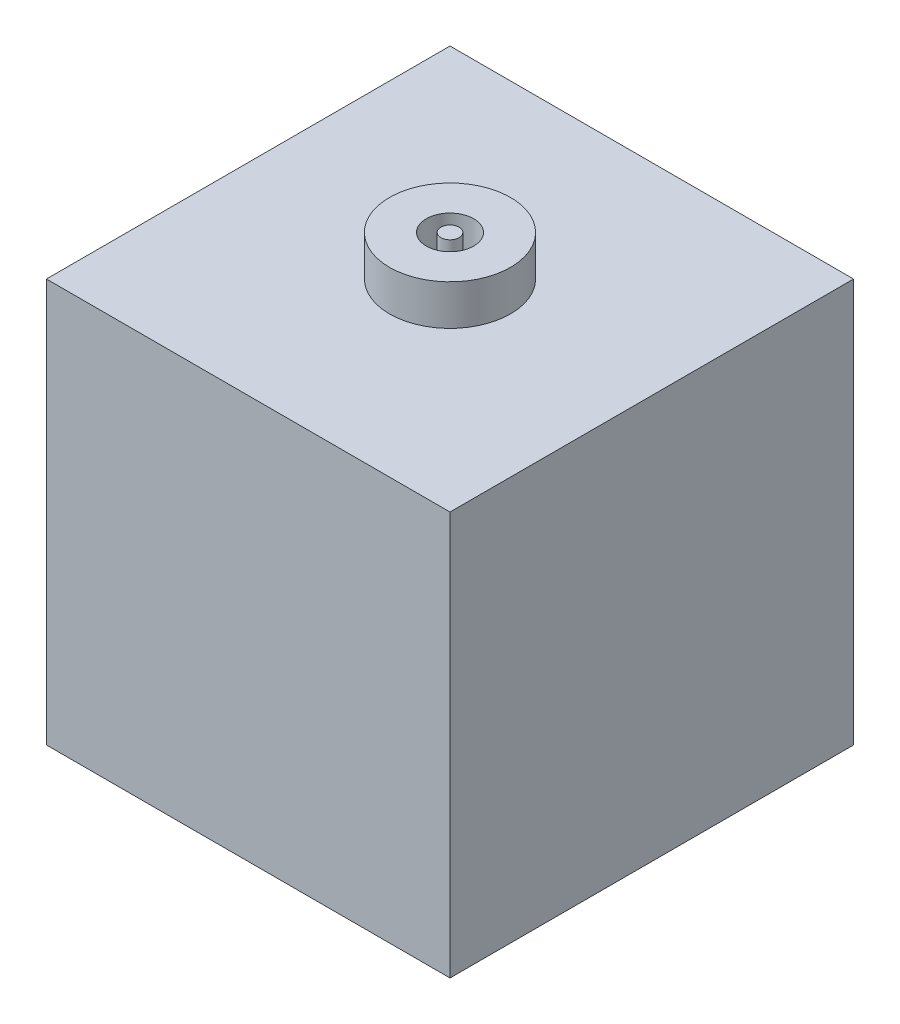
ISO-10303-21;
HEADER;
FILE_DESCRIPTION(('STEP AP214'),'2;1');
FILE_NAME('part.step','',(''),(''),'','','');
FILE_SCHEMA(('AUTOMOTIVE_DESIGN { 1 0 10303 214 1 1 1 1 }'));
ENDSEC;
DATA;
#1=APPLICATION_CONTEXT('core data for automotive mechanical design processes');
#2=APPLICATION_PROTOCOL_DEFINITION('international standard','automotive_design',2000,#1);
#3=PRODUCT_CONTEXT('',#1,'mechanical');
#4=PRODUCT('Part','Part','',(#3));
#5=PRODUCT_RELATED_PRODUCT_CATEGORY('part','',(#4));
#6=PRODUCT_DEFINITION_FORMATION('','',#4);
#7=PRODUCT_DEFINITION_CONTEXT('part definition',#1,'design');
#8=PRODUCT_DEFINITION('design','',#6,#7);
#9=PRODUCT_DEFINITION_SHAPE('','',#8);
#10=(LENGTH_UNIT() NAMED_UNIT(*) SI_UNIT(.MILLI.,.METRE.));
#11=(NAMED_UNIT(*) PLANE_ANGLE_UNIT() SI_UNIT($,.RADIAN.));
#12=(NAMED_UNIT(*) SI_UNIT($,.STERADIAN.) SOLID_ANGLE_UNIT());
#13=UNCERTAINTY_MEASURE_WITH_UNIT(LENGTH_MEASURE(1.E-05),#10,'distance_accuracy_value','');
#14=(GEOMETRIC_REPRESENTATION_CONTEXT(3) GLOBAL_UNCERTAINTY_ASSIGNED_CONTEXT((#13)) GLOBAL_UNIT_ASSIGNED_CONTEXT((#10,
#11,#12)) REPRESENTATION_CONTEXT('',''));
#15=CARTESIAN_POINT('',(0.,0.,0.));
#16=DIRECTION('',(0.,0.,1.));
#17=DIRECTION('',(1.,0.,0.));
#18=AXIS2_PLACEMENT_3D('',#15,#16,#17);
#19=CARTESIAN_POINT('',(0.,0.,0.));
#20=DIRECTION('',(0.,1.,0.));
#21=DIRECTION('',(0.,0.,1.));
#22=AXIS2_PLACEMENT_3D('',#19,#20,#21);
#23=PLANE('',#22);
#24=CARTESIAN_POINT('',(20.,0.,-20.));
#25=DIRECTION('',(0.,1.,0.));
#26=DIRECTION('',(0.,0.,1.));
#27=AXIS2_PLACEMENT_3D('',#24,#25,#26);
#28=CIRCLE('',#27,0.900000000000001);
#29=CARTESIAN_POINT('',(20.,0.,-19.1));
#30=VERTEX_POINT('',#29);
#31=EDGE_CURVE('E145',#30,#30,#28,.T.);
#32=ORIENTED_EDGE('',*,*,#31,.F.);
#33=EDGE_LOOP('',(#32));
#34=FACE_BOUND('',#33,.T.);
#35=CARTESIAN_POINT('',(20.,0.,-20.));
#36=DIRECTION('',(0.,1.,0.));
#37=DIRECTION('',(0.,0.,1.));
#38=AXIS2_PLACEMENT_3D('',#35,#36,#37);
#39=CIRCLE('',#38,2.35);
#40=CARTESIAN_POINT('',(20.,0.,-17.65));
#41=VERTEX_POINT('',#40);
#42=EDGE_CURVE('E12',#41,#41,#39,.F.);
#43=ORIENTED_EDGE('',*,*,#42,.F.);
#44=EDGE_LOOP('',(#43));
#45=FACE_BOUND('',#44,.T.);
#46=ADVANCED_FACE('F44',(#34,#45),#23,.T.);
#47=CARTESIAN_POINT('',(20.,4.,-20.));
#48=DIRECTION('',(0.,-1.,0.));
#49=DIRECTION('',(0.,0.,-1.));
#50=AXIS2_PLACEMENT_3D('',#47,#48,#49);
#51=CYLINDRICAL_SURFACE('',#50,0.900000000000001);
#52=CARTESIAN_POINT('',(20.,4.,-20.));
#53=DIRECTION('',(0.,1.,0.));
#54=DIRECTION('',(0.,0.,1.));
#55=AXIS2_PLACEMENT_3D('',#52,#53,#54);
#56=CIRCLE('',#55,0.900000000000001);
#57=CARTESIAN_POINT('',(20.,4.,-19.1));
#58=VERTEX_POINT('',#57);
#59=EDGE_CURVE('E116',#58,#58,#56,.T.);
#60=ORIENTED_EDGE('',*,*,#59,.F.);
#61=EDGE_LOOP('',(#60));
#62=FACE_BOUND('',#61,.T.);
#63=ORIENTED_EDGE('',*,*,#31,.T.);
#64=EDGE_LOOP('',(#63));
#65=FACE_BOUND('',#64,.T.);
#66=ADVANCED_FACE('F134',(#62,#65),#51,.T.);
#67=CARTESIAN_POINT('',(0.,4.,0.));
#68=DIRECTION('',(0.,1.,0.));
#69=DIRECTION('',(0.,0.,1.));
#70=AXIS2_PLACEMENT_3D('',#67,#68,#69);
#71=PLANE('',#70);
#72=ORIENTED_EDGE('',*,*,#59,.T.);
#73=EDGE_LOOP('',(#72));
#74=FACE_BOUND('',#73,.T.);
#75=ADVANCED_FACE('F139',(#74),#71,.T.);
#76=CARTESIAN_POINT('',(20.,4.,-20.));
#77=DIRECTION('',(0.,-1.,0.));
#78=DIRECTION('',(0.,0.,-1.));
#79=AXIS2_PLACEMENT_3D('',#76,#77,#78);
#80=CYLINDRICAL_SURFACE('',#79,2.35);
#81=CARTESIAN_POINT('',(20.,4.,-20.));
#82=DIRECTION('',(0.,1.,0.));
#83=DIRECTION('',(0.,0.,1.));
#84=AXIS2_PLACEMENT_3D('',#81,#82,#83);
#85=CIRCLE('',#84,2.35);
#86=CARTESIAN_POINT('',(20.,4.,-17.65));
#87=VERTEX_POINT('',#86);
#88=EDGE_CURVE('E175',#87,#87,#85,.T.);
#89=ORIENTED_EDGE('',*,*,#88,.T.);
#90=EDGE_LOOP('',(#89));
#91=FACE_BOUND('',#90,.T.);
#92=ORIENTED_EDGE('',*,*,#42,.T.);
#93=EDGE_LOOP('',(#92));
#94=FACE_BOUND('',#93,.T.);
#95=ADVANCED_FACE('F148',(#91,#94),#80,.F.);
#96=CARTESIAN_POINT('',(20.,4.,-20.));
#97=DIRECTION('',(0.,-1.,0.));
#98=DIRECTION('',(0.,0.,-1.));
#99=AXIS2_PLACEMENT_3D('',#96,#97,#98);
#100=CYLINDRICAL_SURFACE('',#99,6.);
#101=CARTESIAN_POINT('',(20.,4.,-20.));
#102=DIRECTION('',(0.,1.,0.));
#103=DIRECTION('',(0.,0.,1.));
#104=AXIS2_PLACEMENT_3D('',#101,#102,#103);
#105=CIRCLE('',#104,6.);
#106=CARTESIAN_POINT('',(20.,4.,-14.));
#107=VERTEX_POINT('',#106);
#108=EDGE_CURVE('E178',#107,#107,#105,.T.);
#109=ORIENTED_EDGE('',*,*,#108,.F.);
#110=EDGE_LOOP('',(#109));
#111=FACE_BOUND('',#110,.T.);
#112=CARTESIAN_POINT('',(20.,0.,-20.));
#113=DIRECTION('',(0.,1.,0.));
#114=DIRECTION('',(0.,0.,1.));
#115=AXIS2_PLACEMENT_3D('',#112,#113,#114);
#116=CIRCLE('',#115,6.);
#117=CARTESIAN_POINT('',(20.,0.,-14.));
#118=VERTEX_POINT('',#117);
#119=EDGE_CURVE('E180',#118,#118,#116,.T.);
#120=ORIENTED_EDGE('',*,*,#119,.T.);
#121=EDGE_LOOP('',(#120));
#122=FACE_BOUND('',#121,.T.);
#123=ADVANCED_FACE('F150',(#111,#122),#100,.T.);
#124=CARTESIAN_POINT('',(0.,4.,0.));
#125=DIRECTION('',(0.,1.,0.));
#126=DIRECTION('',(0.,0.,1.));
#127=AXIS2_PLACEMENT_3D('',#124,#125,#126);
#128=PLANE('',#127);
#129=ORIENTED_EDGE('',*,*,#88,.F.);
#130=EDGE_LOOP('',(#129));
#131=FACE_BOUND('',#130,.T.);
#132=ORIENTED_EDGE('',*,*,#108,.T.);
#133=EDGE_LOOP('',(#132));
#134=FACE_BOUND('',#133,.T.);
#135=ADVANCED_FACE('F157',(#131,#134),#128,.T.);
#136=CARTESIAN_POINT('',(0.,-40.,0.));
#137=DIRECTION('',(0.,1.,0.));
#138=DIRECTION('',(0.,0.,1.));
#139=AXIS2_PLACEMENT_3D('',#136,#137,#138);
#140=PLANE('',#139);
#141=DIRECTION('',(0.,0.,1.));
#142=VECTOR('',#141,1.);
#143=CARTESIAN_POINT('',(40.,-40.,0.));
#144=LINE('',#143,#142);
#145=CARTESIAN_POINT('',(40.,-40.,-40.));
#146=VERTEX_POINT('',#145);
#147=CARTESIAN_POINT('',(40.,-40.,0.));
#148=VERTEX_POINT('',#147);
#149=EDGE_CURVE('E106',#146,#148,#144,.T.);
#150=ORIENTED_EDGE('',*,*,#149,.T.);
#151=DIRECTION('',(-1.,0.,0.));
#152=VECTOR('',#151,1.);
#153=CARTESIAN_POINT('',(0.,-40.,0.));
#154=LINE('',#153,#152);
#155=CARTESIAN_POINT('',(0.,-40.,0.));
#156=VERTEX_POINT('',#155);
#157=EDGE_CURVE('E61',#148,#156,#154,.T.);
#158=ORIENTED_EDGE('',*,*,#157,.T.);
#159=DIRECTION('',(0.,0.,-1.));
#160=VECTOR('',#159,1.);
#161=CARTESIAN_POINT('',(0.,-40.,0.));
#162=LINE('',#161,#160);
#163=CARTESIAN_POINT('',(0.,-40.,-40.));
#164=VERTEX_POINT('',#163);
#165=EDGE_CURVE('E89',#156,#164,#162,.T.);
#166=ORIENTED_EDGE('',*,*,#165,.T.);
#167=DIRECTION('',(1.,0.,0.));
#168=VECTOR('',#167,1.);
#169=CARTESIAN_POINT('',(0.,-40.,-40.));
#170=LINE('',#169,#168);
#171=EDGE_CURVE('E86',#164,#146,#170,.T.);
#172=ORIENTED_EDGE('',*,*,#171,.T.);
#173=EDGE_LOOP('',(#150,#158,#166,#172));
#174=FACE_BOUND('',#173,.T.);
#175=ADVANCED_FACE('F91',(#174),#140,.F.);
#176=CARTESIAN_POINT('',(0.,-40.,0.));
#177=DIRECTION('',(0.,0.,-1.));
#178=DIRECTION('',(-1.,0.,0.));
#179=AXIS2_PLACEMENT_3D('',#176,#177,#178);
#180=PLANE('',#179);
#181=DIRECTION('',(-1.,0.,0.));
#182=VECTOR('',#181,1.);
#183=CARTESIAN_POINT('',(0.,0.,0.));
#184=LINE('',#183,#182);
#185=CARTESIAN_POINT('',(40.,0.,0.));
#186=VERTEX_POINT('',#185);
#187=CARTESIAN_POINT('',(0.,0.,0.));
#188=VERTEX_POINT('',#187);
#189=EDGE_CURVE('E75',#186,#188,#184,.T.);
#190=ORIENTED_EDGE('',*,*,#189,.T.);
#191=DIRECTION('',(0.,1.,0.));
#192=VECTOR('',#191,1.);
#193=CARTESIAN_POINT('',(0.,-40.,0.));
#194=LINE('',#193,#192);
#195=EDGE_CURVE('E100',#156,#188,#194,.T.);
#196=ORIENTED_EDGE('',*,*,#195,.F.);
#197=ORIENTED_EDGE('',*,*,#157,.F.);
#198=DIRECTION('',(0.,1.,0.));
#199=VECTOR('',#198,1.);
#200=CARTESIAN_POINT('',(40.,-40.,0.));
#201=LINE('',#200,#199);
#202=EDGE_CURVE('E53',#148,#186,#201,.T.);
#203=ORIENTED_EDGE('',*,*,#202,.T.);
#204=EDGE_LOOP('',(#190,#196,#197,#203));
#205=FACE_BOUND('',#204,.T.);
#206=ADVANCED_FACE('F165',(#205),#180,.F.);
#207=CARTESIAN_POINT('',(0.,-40.,0.));
#208=DIRECTION('',(1.,0.,0.));
#209=DIRECTION('',(0.,0.,-1.));
#210=AXIS2_PLACEMENT_3D('',#207,#208,#209);
#211=PLANE('',#210);
#212=DIRECTION('',(0.,0.,-1.));
#213=VECTOR('',#212,1.);
#214=CARTESIAN_POINT('',(0.,0.,0.));
#215=LINE('',#214,#213);
#216=CARTESIAN_POINT('',(0.,0.,-40.));
#217=VERTEX_POINT('',#216);
#218=EDGE_CURVE('E97',#188,#217,#215,.T.);
#219=ORIENTED_EDGE('',*,*,#218,.T.);
#220=DIRECTION('',(0.,1.,0.));
#221=VECTOR('',#220,1.);
#222=CARTESIAN_POINT('',(0.,-40.,-40.));
#223=LINE('',#222,#221);
#224=EDGE_CURVE('E95',#164,#217,#223,.T.);
#225=ORIENTED_EDGE('',*,*,#224,.F.);
#226=ORIENTED_EDGE('',*,*,#165,.F.);
#227=ORIENTED_EDGE('',*,*,#195,.T.);
#228=EDGE_LOOP('',(#219,#225,#226,#227));
#229=FACE_BOUND('',#228,.T.);
#230=ADVANCED_FACE('F96',(#229),#211,.F.);
#231=CARTESIAN_POINT('',(0.,-40.,-40.));
#232=DIRECTION('',(0.,0.,1.));
#233=DIRECTION('',(1.,0.,0.));
#234=AXIS2_PLACEMENT_3D('',#231,#232,#233);
#235=PLANE('',#234);
#236=DIRECTION('',(1.,0.,0.));
#237=VECTOR('',#236,1.);
#238=CARTESIAN_POINT('',(0.,0.,-40.));
#239=LINE('',#238,#237);
#240=CARTESIAN_POINT('',(40.,0.,-40.));
#241=VERTEX_POINT('',#240);
#242=EDGE_CURVE('E115',#217,#241,#239,.T.);
#243=ORIENTED_EDGE('',*,*,#242,.T.);
#244=DIRECTION('',(0.,1.,0.));
#245=VECTOR('',#244,1.);
#246=CARTESIAN_POINT('',(40.,-40.,-40.));
#247=LINE('',#246,#245);
#248=EDGE_CURVE('E101',#146,#241,#247,.T.);
#249=ORIENTED_EDGE('',*,*,#248,.F.);
#250=ORIENTED_EDGE('',*,*,#171,.F.);
#251=ORIENTED_EDGE('',*,*,#224,.T.);
#252=EDGE_LOOP('',(#243,#249,#250,#251));
#253=FACE_BOUND('',#252,.T.);
#254=ADVANCED_FACE('F103',(#253),#235,.F.);
#255=CARTESIAN_POINT('',(40.,-40.,0.));
#256=DIRECTION('',(-1.,0.,0.));
#257=DIRECTION('',(0.,0.,1.));
#258=AXIS2_PLACEMENT_3D('',#255,#256,#257);
#259=PLANE('',#258);
#260=DIRECTION('',(0.,0.,1.));
#261=VECTOR('',#260,1.);
#262=CARTESIAN_POINT('',(40.,0.,0.));
#263=LINE('',#262,#261);
#264=EDGE_CURVE('E112',#241,#186,#263,.T.);
#265=ORIENTED_EDGE('',*,*,#264,.T.);
#266=ORIENTED_EDGE('',*,*,#202,.F.);
#267=ORIENTED_EDGE('',*,*,#149,.F.);
#268=ORIENTED_EDGE('',*,*,#248,.T.);
#269=EDGE_LOOP('',(#265,#266,#267,#268));
#270=FACE_BOUND('',#269,.T.);
#271=ADVANCED_FACE('F46',(#270),#259,.F.);
#272=ORIENTED_EDGE('',*,*,#119,.F.);
#273=EDGE_LOOP('',(#272));
#274=FACE_BOUND('',#273,.T.);
#275=ORIENTED_EDGE('',*,*,#264,.F.);
#276=ORIENTED_EDGE('',*,*,#242,.F.);
#277=ORIENTED_EDGE('',*,*,#218,.F.);
#278=ORIENTED_EDGE('',*,*,#189,.F.);
#279=EDGE_LOOP('',(#275,#276,#277,#278));
#280=FACE_BOUND('',#279,.T.);
#281=ADVANCED_FACE('F123',(#274,#280),#23,.T.);
#282=CLOSED_SHELL('',(#46,#66,#75,#95,#123,#135,#175,#206,#230,#254,#271,#281));
#283=MANIFOLD_SOLID_BREP('B2',#282);
#284=ADVANCED_BREP_SHAPE_REPRESENTATION('',(#18,#283),#14);
#285=SHAPE_DEFINITION_REPRESENTATION(#9,#284);
ENDSEC;
END-ISO-10303-21;
